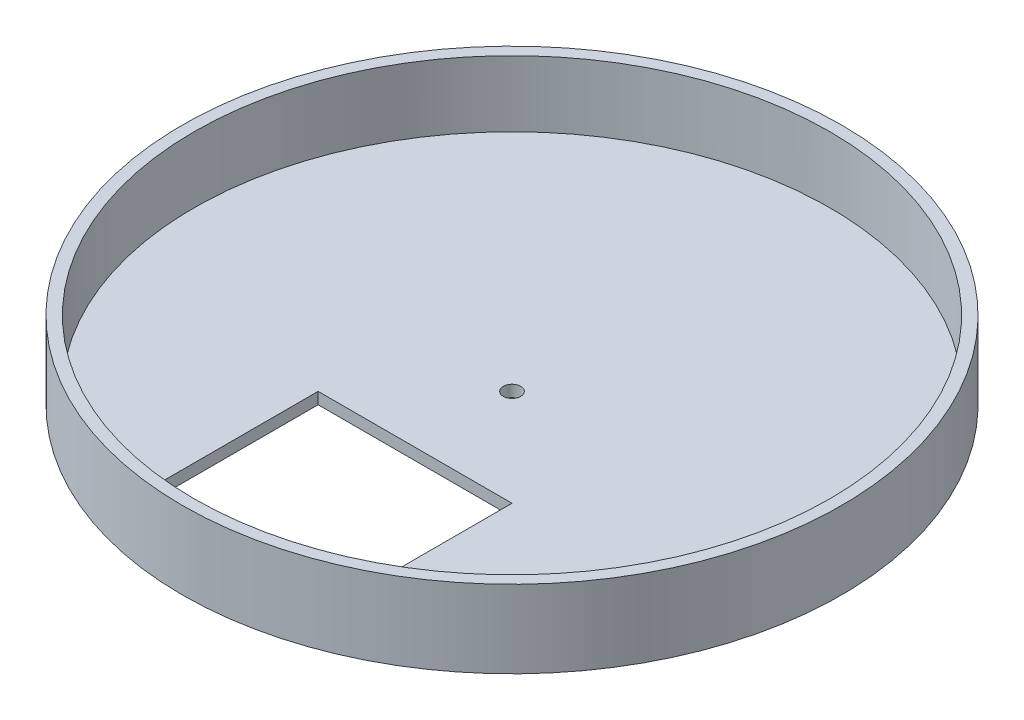
ISO-10303-21;
HEADER;
FILE_DESCRIPTION(('STEP AP214'),'2;1');
FILE_NAME('part.step','',(''),(''),'','','');
FILE_SCHEMA(('AUTOMOTIVE_DESIGN { 1 0 10303 214 1 1 1 1 }'));
ENDSEC;
DATA;
#1=APPLICATION_CONTEXT('core data for automotive mechanical design processes');
#2=APPLICATION_PROTOCOL_DEFINITION('international standard','automotive_design',2000,#1);
#3=PRODUCT_CONTEXT('',#1,'mechanical');
#4=PRODUCT('Part','Part','',(#3));
#5=PRODUCT_RELATED_PRODUCT_CATEGORY('part','',(#4));
#6=PRODUCT_DEFINITION_FORMATION('','',#4);
#7=PRODUCT_DEFINITION_CONTEXT('part definition',#1,'design');
#8=PRODUCT_DEFINITION('design','',#6,#7);
#9=PRODUCT_DEFINITION_SHAPE('','',#8);
#10=(LENGTH_UNIT() NAMED_UNIT(*) SI_UNIT(.MILLI.,.METRE.));
#11=(NAMED_UNIT(*) PLANE_ANGLE_UNIT() SI_UNIT($,.RADIAN.));
#12=(NAMED_UNIT(*) SI_UNIT($,.STERADIAN.) SOLID_ANGLE_UNIT());
#13=UNCERTAINTY_MEASURE_WITH_UNIT(LENGTH_MEASURE(1.E-05),#10,'distance_accuracy_value','');
#14=(GEOMETRIC_REPRESENTATION_CONTEXT(3) GLOBAL_UNCERTAINTY_ASSIGNED_CONTEXT((#13)) GLOBAL_UNIT_ASSIGNED_CONTEXT((#10,
#11,#12)) REPRESENTATION_CONTEXT('',''));
#15=CARTESIAN_POINT('',(0.,0.,0.));
#16=DIRECTION('',(0.,0.,1.));
#17=DIRECTION('',(1.,0.,0.));
#18=AXIS2_PLACEMENT_3D('',#15,#16,#17);
#19=CARTESIAN_POINT('',(0.,50.8,0.));
#20=DIRECTION('',(0.,-1.,0.));
#21=DIRECTION('',(0.,0.,-1.));
#22=AXIS2_PLACEMENT_3D('',#19,#20,#21);
#23=CYLINDRICAL_SURFACE('',#22,215.9);
#24=CARTESIAN_POINT('',(0.,50.8,0.));
#25=DIRECTION('',(0.,1.,0.));
#26=DIRECTION('',(0.,0.,1.));
#27=AXIS2_PLACEMENT_3D('',#24,#25,#26);
#28=CIRCLE('',#27,215.9);
#29=CARTESIAN_POINT('',(0.,50.8,215.9));
#30=VERTEX_POINT('',#29);
#31=EDGE_CURVE('E13',#30,#30,#28,.T.);
#32=ORIENTED_EDGE('',*,*,#31,.F.);
#33=EDGE_LOOP('',(#32));
#34=FACE_BOUND('',#33,.T.);
#35=CARTESIAN_POINT('',(0.,0.,0.));
#36=DIRECTION('',(0.,1.,0.));
#37=DIRECTION('',(0.,0.,1.));
#38=AXIS2_PLACEMENT_3D('',#35,#36,#37);
#39=CIRCLE('',#38,215.9);
#40=CARTESIAN_POINT('',(0.,0.,215.9));
#41=VERTEX_POINT('',#40);
#42=EDGE_CURVE('E58',#41,#41,#39,.T.);
#43=ORIENTED_EDGE('',*,*,#42,.T.);
#44=EDGE_LOOP('',(#43));
#45=FACE_BOUND('',#44,.T.);
#46=ADVANCED_FACE('F55',(#34,#45),#23,.T.);
#47=CARTESIAN_POINT('',(0.,50.8,0.));
#48=DIRECTION('',(0.,1.,0.));
#49=DIRECTION('',(0.,0.,1.));
#50=AXIS2_PLACEMENT_3D('',#47,#48,#49);
#51=PLANE('',#50);
#52=CARTESIAN_POINT('',(0.,50.8,0.));
#53=DIRECTION('',(0.,1.,0.));
#54=DIRECTION('',(0.,0.,1.));
#55=AXIS2_PLACEMENT_3D('',#52,#53,#54);
#56=CIRCLE('',#55,208.28);
#57=CARTESIAN_POINT('',(0.,50.8,208.28));
#58=VERTEX_POINT('',#57);
#59=EDGE_CURVE('E132',#58,#58,#56,.T.);
#60=ORIENTED_EDGE('',*,*,#59,.F.);
#61=EDGE_LOOP('',(#60));
#62=FACE_BOUND('',#61,.T.);
#63=ORIENTED_EDGE('',*,*,#31,.T.);
#64=EDGE_LOOP('',(#63));
#65=FACE_BOUND('',#64,.T.);
#66=ADVANCED_FACE('F141',(#62,#65),#51,.T.);
#67=CARTESIAN_POINT('',(0.,0.,0.));
#68=DIRECTION('',(0.,1.,0.));
#69=DIRECTION('',(0.,0.,1.));
#70=AXIS2_PLACEMENT_3D('',#67,#68,#69);
#71=PLANE('',#70);
#72=CARTESIAN_POINT('',(0.,0.,0.));
#73=DIRECTION('',(0.,1.,0.));
#74=DIRECTION('',(0.,0.,1.));
#75=AXIS2_PLACEMENT_3D('',#72,#73,#74);
#76=CIRCLE('',#75,5.715);
#77=CARTESIAN_POINT('',(0.,0.,5.715));
#78=VERTEX_POINT('',#77);
#79=EDGE_CURVE('E128',#78,#78,#76,.T.);
#80=ORIENTED_EDGE('',*,*,#79,.T.);
#81=EDGE_LOOP('',(#80));
#82=FACE_BOUND('',#81,.T.);
#83=DIRECTION('',(-1.,0.,0.));
#84=VECTOR('',#83,1.);
#85=CARTESIAN_POINT('',(-63.5,0.,63.5));
#86=LINE('',#85,#84);
#87=CARTESIAN_POINT('',(63.5,0.,63.5));
#88=VERTEX_POINT('',#87);
#89=CARTESIAN_POINT('',(-63.5,0.,63.5));
#90=VERTEX_POINT('',#89);
#91=EDGE_CURVE('E106',#88,#90,#86,.T.);
#92=ORIENTED_EDGE('',*,*,#91,.T.);
#93=DIRECTION('',(0.,0.,1.));
#94=VECTOR('',#93,1.);
#95=CARTESIAN_POINT('',(-63.5,0.,63.5));
#96=LINE('',#95,#94);
#97=CARTESIAN_POINT('',(-63.5,0.,198.364080417801));
#98=VERTEX_POINT('',#97);
#99=EDGE_CURVE('E98',#90,#98,#96,.T.);
#100=ORIENTED_EDGE('',*,*,#99,.T.);
#101=CARTESIAN_POINT('',(0.,0.,5.55111512312578E-13));
#102=DIRECTION('',(0.,1.,0.));
#103=DIRECTION('',(0.,0.,1.));
#104=AXIS2_PLACEMENT_3D('',#101,#102,#103);
#105=CIRCLE('',#104,208.279999999999);
#106=CARTESIAN_POINT('',(63.5,0.,198.364080417801));
#107=VERTEX_POINT('',#106);
#108=EDGE_CURVE('E109',#98,#107,#105,.T.);
#109=ORIENTED_EDGE('',*,*,#108,.T.);
#110=DIRECTION('',(0.,0.,-1.));
#111=VECTOR('',#110,1.);
#112=CARTESIAN_POINT('',(63.5,0.,63.5));
#113=LINE('',#112,#111);
#114=EDGE_CURVE('E74',#107,#88,#113,.T.);
#115=ORIENTED_EDGE('',*,*,#114,.T.);
#116=EDGE_LOOP('',(#92,#100,#109,#115));
#117=FACE_BOUND('',#116,.T.);
#118=ORIENTED_EDGE('',*,*,#42,.F.);
#119=EDGE_LOOP('',(#118));
#120=FACE_BOUND('',#119,.T.);
#121=ADVANCED_FACE('F114',(#82,#117,#120),#71,.F.);
#122=CARTESIAN_POINT('',(0.,7.62,0.));
#123=DIRECTION('',(0.,1.,0.));
#124=DIRECTION('',(0.,0.,1.));
#125=AXIS2_PLACEMENT_3D('',#122,#123,#124);
#126=CYLINDRICAL_SURFACE('',#125,208.28);
#127=CARTESIAN_POINT('',(0.,7.62,0.));
#128=DIRECTION('',(0.,1.,0.));
#129=DIRECTION('',(0.,0.,1.));
#130=AXIS2_PLACEMENT_3D('',#127,#128,#129);
#131=CIRCLE('',#130,208.28);
#132=CARTESIAN_POINT('',(63.5,7.62,198.364080417801));
#133=VERTEX_POINT('',#132);
#134=CARTESIAN_POINT('',(-63.5,7.62,198.364080417801));
#135=VERTEX_POINT('',#134);
#136=EDGE_CURVE('E136',#133,#135,#131,.T.);
#137=ORIENTED_EDGE('',*,*,#136,.F.);
#138=DIRECTION('',(0.,1.,0.));
#139=VECTOR('',#138,1.);
#140=CARTESIAN_POINT('',(63.5,0.,198.364080417801));
#141=LINE('',#140,#139);
#142=EDGE_CURVE('E105',#107,#133,#141,.T.);
#143=ORIENTED_EDGE('',*,*,#142,.F.);
#144=ORIENTED_EDGE('',*,*,#108,.F.);
#145=DIRECTION('',(0.,1.,0.));
#146=VECTOR('',#145,1.);
#147=CARTESIAN_POINT('',(-63.5,0.,198.364080417801));
#148=LINE('',#147,#146);
#149=EDGE_CURVE('E94',#98,#135,#148,.T.);
#150=ORIENTED_EDGE('',*,*,#149,.T.);
#151=EDGE_LOOP('',(#137,#143,#144,#150));
#152=FACE_BOUND('',#151,.T.);
#153=ORIENTED_EDGE('',*,*,#59,.T.);
#154=EDGE_LOOP('',(#153));
#155=FACE_BOUND('',#154,.T.);
#156=ADVANCED_FACE('F110',(#152,#155),#126,.F.);
#157=CARTESIAN_POINT('',(0.,7.62,0.));
#158=DIRECTION('',(0.,1.,0.));
#159=DIRECTION('',(0.,0.,1.));
#160=AXIS2_PLACEMENT_3D('',#157,#158,#159);
#161=PLANE('',#160);
#162=CARTESIAN_POINT('',(0.,7.62,0.));
#163=DIRECTION('',(0.,1.,0.));
#164=DIRECTION('',(0.,0.,1.));
#165=AXIS2_PLACEMENT_3D('',#162,#163,#164);
#166=CIRCLE('',#165,5.715);
#167=CARTESIAN_POINT('',(0.,7.62,5.715));
#168=VERTEX_POINT('',#167);
#169=EDGE_CURVE('E122',#168,#168,#166,.T.);
#170=ORIENTED_EDGE('',*,*,#169,.F.);
#171=EDGE_LOOP('',(#170));
#172=FACE_BOUND('',#171,.T.);
#173=DIRECTION('',(0.,0.,1.));
#174=VECTOR('',#173,1.);
#175=CARTESIAN_POINT('',(-63.5,7.62,63.5));
#176=LINE('',#175,#174);
#177=CARTESIAN_POINT('',(-63.5,7.62,63.5));
#178=VERTEX_POINT('',#177);
#179=EDGE_CURVE('E101',#178,#135,#176,.T.);
#180=ORIENTED_EDGE('',*,*,#179,.F.);
#181=DIRECTION('',(-1.,0.,0.));
#182=VECTOR('',#181,1.);
#183=CARTESIAN_POINT('',(-63.5,7.62,63.5));
#184=LINE('',#183,#182);
#185=CARTESIAN_POINT('',(63.5,7.62,63.5));
#186=VERTEX_POINT('',#185);
#187=EDGE_CURVE('E117',#186,#178,#184,.T.);
#188=ORIENTED_EDGE('',*,*,#187,.F.);
#189=DIRECTION('',(0.,0.,-1.));
#190=VECTOR('',#189,1.);
#191=CARTESIAN_POINT('',(63.5,7.62,63.5));
#192=LINE('',#191,#190);
#193=EDGE_CURVE('E69',#133,#186,#192,.T.);
#194=ORIENTED_EDGE('',*,*,#193,.F.);
#195=ORIENTED_EDGE('',*,*,#136,.T.);
#196=EDGE_LOOP('',(#180,#188,#194,#195));
#197=FACE_BOUND('',#196,.T.);
#198=ADVANCED_FACE('F156',(#172,#197),#161,.T.);
#199=CARTESIAN_POINT('',(-63.5,0.,63.5));
#200=DIRECTION('',(-1.,0.,0.));
#201=DIRECTION('',(0.,0.,1.));
#202=AXIS2_PLACEMENT_3D('',#199,#200,#201);
#203=PLANE('',#202);
#204=ORIENTED_EDGE('',*,*,#179,.T.);
#205=ORIENTED_EDGE('',*,*,#149,.F.);
#206=ORIENTED_EDGE('',*,*,#99,.F.);
#207=DIRECTION('',(0.,1.,0.));
#208=VECTOR('',#207,1.);
#209=CARTESIAN_POINT('',(-63.5,0.,63.5));
#210=LINE('',#209,#208);
#211=EDGE_CURVE('E130',#90,#178,#210,.T.);
#212=ORIENTED_EDGE('',*,*,#211,.T.);
#213=EDGE_LOOP('',(#204,#205,#206,#212));
#214=FACE_BOUND('',#213,.T.);
#215=ADVANCED_FACE('F96',(#214),#203,.F.);
#216=CARTESIAN_POINT('',(-63.5,0.,63.5));
#217=DIRECTION('',(0.,0.,-1.));
#218=DIRECTION('',(-1.,0.,0.));
#219=AXIS2_PLACEMENT_3D('',#216,#217,#218);
#220=PLANE('',#219);
#221=ORIENTED_EDGE('',*,*,#187,.T.);
#222=ORIENTED_EDGE('',*,*,#211,.F.);
#223=ORIENTED_EDGE('',*,*,#91,.F.);
#224=DIRECTION('',(0.,1.,0.));
#225=VECTOR('',#224,1.);
#226=CARTESIAN_POINT('',(63.5,0.,63.5));
#227=LINE('',#226,#225);
#228=EDGE_CURVE('E133',#88,#186,#227,.T.);
#229=ORIENTED_EDGE('',*,*,#228,.T.);
#230=EDGE_LOOP('',(#221,#222,#223,#229));
#231=FACE_BOUND('',#230,.T.);
#232=ADVANCED_FACE('F165',(#231),#220,.F.);
#233=CARTESIAN_POINT('',(63.5,0.,63.5));
#234=DIRECTION('',(1.,0.,0.));
#235=DIRECTION('',(0.,0.,-1.));
#236=AXIS2_PLACEMENT_3D('',#233,#234,#235);
#237=PLANE('',#236);
#238=ORIENTED_EDGE('',*,*,#193,.T.);
#239=ORIENTED_EDGE('',*,*,#228,.F.);
#240=ORIENTED_EDGE('',*,*,#114,.F.);
#241=ORIENTED_EDGE('',*,*,#142,.T.);
#242=EDGE_LOOP('',(#238,#239,#240,#241));
#243=FACE_BOUND('',#242,.T.);
#244=ADVANCED_FACE('F166',(#243),#237,.F.);
#245=CARTESIAN_POINT('',(0.,0.,0.));
#246=DIRECTION('',(0.,1.,0.));
#247=DIRECTION('',(0.,0.,1.));
#248=AXIS2_PLACEMENT_3D('',#245,#246,#247);
#249=CYLINDRICAL_SURFACE('',#248,5.715);
#250=ORIENTED_EDGE('',*,*,#79,.F.);
#251=EDGE_LOOP('',(#250));
#252=FACE_BOUND('',#251,.T.);
#253=ORIENTED_EDGE('',*,*,#169,.T.);
#254=EDGE_LOOP('',(#253));
#255=FACE_BOUND('',#254,.T.);
#256=ADVANCED_FACE('F169',(#252,#255),#249,.F.);
#257=CLOSED_SHELL('',(#46,#66,#121,#156,#198,#215,#232,#244,#256));
#258=MANIFOLD_SOLID_BREP('B2',#257);
#259=ADVANCED_BREP_SHAPE_REPRESENTATION('',(#18,#258),#14);
#260=SHAPE_DEFINITION_REPRESENTATION(#9,#259);
ENDSEC;
END-ISO-10303-21;
